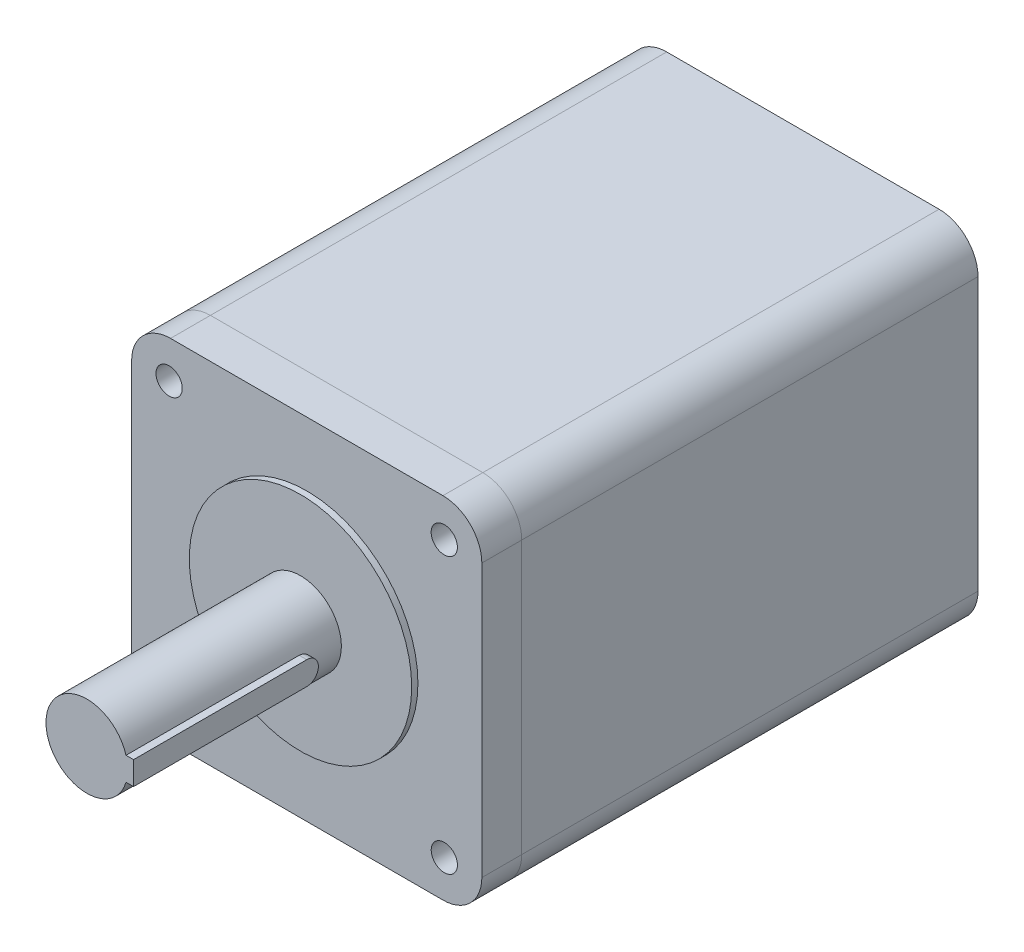
ISO-10303-21;
HEADER;
FILE_DESCRIPTION(('STEP AP214'),'2;1');
FILE_NAME('part.step','',(''),(''),'','','');
FILE_SCHEMA(('AUTOMOTIVE_DESIGN { 1 0 10303 214 1 1 1 1 }'));
ENDSEC;
DATA;
#1=APPLICATION_CONTEXT('core data for automotive mechanical design processes');
#2=APPLICATION_PROTOCOL_DEFINITION('international standard','automotive_design',2000,#1);
#3=PRODUCT_CONTEXT('',#1,'mechanical');
#4=PRODUCT('Part','Part','',(#3));
#5=PRODUCT_RELATED_PRODUCT_CATEGORY('part','',(#4));
#6=PRODUCT_DEFINITION_FORMATION('','',#4);
#7=PRODUCT_DEFINITION_CONTEXT('part definition',#1,'design');
#8=PRODUCT_DEFINITION('design','',#6,#7);
#9=PRODUCT_DEFINITION_SHAPE('','',#8);
#10=(LENGTH_UNIT() NAMED_UNIT(*) SI_UNIT(.MILLI.,.METRE.));
#11=(NAMED_UNIT(*) PLANE_ANGLE_UNIT() SI_UNIT($,.RADIAN.));
#12=(NAMED_UNIT(*) SI_UNIT($,.STERADIAN.) SOLID_ANGLE_UNIT());
#13=UNCERTAINTY_MEASURE_WITH_UNIT(LENGTH_MEASURE(1.E-05),#10,'distance_accuracy_value','');
#14=(GEOMETRIC_REPRESENTATION_CONTEXT(3) GLOBAL_UNCERTAINTY_ASSIGNED_CONTEXT((#13)) GLOBAL_UNIT_ASSIGNED_CONTEXT((#10,
#11,#12)) REPRESENTATION_CONTEXT('',''));
#15=CARTESIAN_POINT('',(0.,0.,0.));
#16=DIRECTION('',(0.,0.,1.));
#17=DIRECTION('',(1.,0.,0.));
#18=AXIS2_PLACEMENT_3D('',#15,#16,#17);
#19=CARTESIAN_POINT('',(-69.9999999999999,-70.,-234.5));
#20=DIRECTION('',(0.,0.,1.));
#21=DIRECTION('',(1.,0.,0.));
#22=AXIS2_PLACEMENT_3D('',#19,#20,#21);
#23=CYLINDRICAL_SURFACE('',#22,20.);
#24=CARTESIAN_POINT('',(-69.9999999999999,-70.,0.));
#25=DIRECTION('',(0.,0.,-1.));
#26=DIRECTION('',(1.,0.,0.));
#27=AXIS2_PLACEMENT_3D('',#24,#25,#26);
#28=CIRCLE('',#27,20.);
#29=CARTESIAN_POINT('',(-69.9999999999998,-90.,0.));
#30=VERTEX_POINT('',#29);
#31=CARTESIAN_POINT('',(-89.9999999999999,-69.9999999999999,0.));
#32=VERTEX_POINT('',#31);
#33=EDGE_CURVE('E144',#30,#32,#28,.T.);
#34=ORIENTED_EDGE('',*,*,#33,.T.);
#35=DIRECTION('',(0.,0.,1.));
#36=VECTOR('',#35,1.);
#37=CARTESIAN_POINT('',(-89.9999999999999,-69.9999999999999,-234.5));
#38=LINE('',#37,#36);
#39=CARTESIAN_POINT('',(-89.9999999999999,-69.9999999999999,-234.5));
#40=VERTEX_POINT('',#39);
#41=EDGE_CURVE('E12',#40,#32,#38,.T.);
#42=ORIENTED_EDGE('',*,*,#41,.F.);
#43=CARTESIAN_POINT('',(-69.9999999999999,-70.,-234.5));
#44=DIRECTION('',(0.,0.,-1.));
#45=DIRECTION('',(1.,0.,0.));
#46=AXIS2_PLACEMENT_3D('',#43,#44,#45);
#47=CIRCLE('',#46,20.);
#48=CARTESIAN_POINT('',(-69.9999999999998,-90.,-234.5));
#49=VERTEX_POINT('',#48);
#50=EDGE_CURVE('E158',#49,#40,#47,.T.);
#51=ORIENTED_EDGE('',*,*,#50,.F.);
#52=DIRECTION('',(0.,0.,1.));
#53=VECTOR('',#52,1.);
#54=CARTESIAN_POINT('',(-69.9999999999998,-90.,-234.5));
#55=LINE('',#54,#53);
#56=EDGE_CURVE('E140',#49,#30,#55,.T.);
#57=ORIENTED_EDGE('',*,*,#56,.T.);
#58=EDGE_LOOP('',(#34,#42,#51,#57));
#59=FACE_BOUND('',#58,.T.);
#60=ADVANCED_FACE('F48',(#59),#23,.T.);
#61=CARTESIAN_POINT('',(-89.9999999999999,-69.9999999999999,-234.5));
#62=DIRECTION('',(1.,0.,0.));
#63=DIRECTION('',(0.,0.,-1.));
#64=AXIS2_PLACEMENT_3D('',#61,#62,#63);
#65=PLANE('',#64);
#66=DIRECTION('',(0.,1.,0.));
#67=VECTOR('',#66,1.);
#68=CARTESIAN_POINT('',(-89.9999999999999,-69.9999999999999,0.));
#69=LINE('',#68,#67);
#70=CARTESIAN_POINT('',(-89.9999999999999,69.9999999999999,0.));
#71=VERTEX_POINT('',#70);
#72=EDGE_CURVE('E147',#32,#71,#69,.T.);
#73=ORIENTED_EDGE('',*,*,#72,.T.);
#74=DIRECTION('',(0.,0.,1.));
#75=VECTOR('',#74,1.);
#76=CARTESIAN_POINT('',(-89.9999999999999,69.9999999999999,-234.5));
#77=LINE('',#76,#75);
#78=CARTESIAN_POINT('',(-89.9999999999999,69.9999999999999,-234.5));
#79=VERTEX_POINT('',#78);
#80=EDGE_CURVE('E56',#79,#71,#77,.T.);
#81=ORIENTED_EDGE('',*,*,#80,.F.);
#82=DIRECTION('',(0.,1.,0.));
#83=VECTOR('',#82,1.);
#84=CARTESIAN_POINT('',(-89.9999999999999,-69.9999999999999,-234.5));
#85=LINE('',#84,#83);
#86=EDGE_CURVE('E107',#40,#79,#85,.T.);
#87=ORIENTED_EDGE('',*,*,#86,.F.);
#88=ORIENTED_EDGE('',*,*,#41,.T.);
#89=EDGE_LOOP('',(#73,#81,#87,#88));
#90=FACE_BOUND('',#89,.T.);
#91=ADVANCED_FACE('F193',(#90),#65,.F.);
#92=CARTESIAN_POINT('',(-69.9999999999999,70.,-234.5));
#93=DIRECTION('',(0.,0.,1.));
#94=DIRECTION('',(1.,0.,0.));
#95=AXIS2_PLACEMENT_3D('',#92,#93,#94);
#96=CYLINDRICAL_SURFACE('',#95,20.);
#97=CARTESIAN_POINT('',(-69.9999999999999,70.,0.));
#98=DIRECTION('',(0.,0.,-1.));
#99=DIRECTION('',(-1.,0.,0.));
#100=AXIS2_PLACEMENT_3D('',#97,#98,#99);
#101=CIRCLE('',#100,20.);
#102=CARTESIAN_POINT('',(-69.9999999999998,90.,0.));
#103=VERTEX_POINT('',#102);
#104=EDGE_CURVE('E149',#71,#103,#101,.T.);
#105=ORIENTED_EDGE('',*,*,#104,.T.);
#106=DIRECTION('',(0.,0.,1.));
#107=VECTOR('',#106,1.);
#108=CARTESIAN_POINT('',(-69.9999999999998,90.,-234.5));
#109=LINE('',#108,#107);
#110=CARTESIAN_POINT('',(-69.9999999999998,90.,-234.5));
#111=VERTEX_POINT('',#110);
#112=EDGE_CURVE('E165',#111,#103,#109,.T.);
#113=ORIENTED_EDGE('',*,*,#112,.F.);
#114=CARTESIAN_POINT('',(-69.9999999999999,70.,-234.5));
#115=DIRECTION('',(0.,0.,-1.));
#116=DIRECTION('',(-1.,0.,0.));
#117=AXIS2_PLACEMENT_3D('',#114,#115,#116);
#118=CIRCLE('',#117,20.);
#119=EDGE_CURVE('E173',#79,#111,#118,.T.);
#120=ORIENTED_EDGE('',*,*,#119,.F.);
#121=ORIENTED_EDGE('',*,*,#80,.T.);
#122=EDGE_LOOP('',(#105,#113,#120,#121));
#123=FACE_BOUND('',#122,.T.);
#124=ADVANCED_FACE('F171',(#123),#96,.T.);
#125=CARTESIAN_POINT('',(69.9999999999998,90.,-234.5));
#126=DIRECTION('',(0.,-1.,0.));
#127=DIRECTION('',(0.,0.,-1.));
#128=AXIS2_PLACEMENT_3D('',#125,#126,#127);
#129=PLANE('',#128);
#130=DIRECTION('',(1.,0.,0.));
#131=VECTOR('',#130,1.);
#132=CARTESIAN_POINT('',(69.9999999999998,90.,0.));
#133=LINE('',#132,#131);
#134=CARTESIAN_POINT('',(69.9999999999998,90.,0.));
#135=VERTEX_POINT('',#134);
#136=EDGE_CURVE('E151',#103,#135,#133,.T.);
#137=ORIENTED_EDGE('',*,*,#136,.T.);
#138=DIRECTION('',(0.,0.,1.));
#139=VECTOR('',#138,1.);
#140=CARTESIAN_POINT('',(69.9999999999998,90.,-234.5));
#141=LINE('',#140,#139);
#142=CARTESIAN_POINT('',(69.9999999999998,90.,-234.5));
#143=VERTEX_POINT('',#142);
#144=EDGE_CURVE('E162',#143,#135,#141,.T.);
#145=ORIENTED_EDGE('',*,*,#144,.F.);
#146=DIRECTION('',(1.,0.,0.));
#147=VECTOR('',#146,1.);
#148=CARTESIAN_POINT('',(69.9999999999998,90.,-234.5));
#149=LINE('',#148,#147);
#150=EDGE_CURVE('E185',#111,#143,#149,.T.);
#151=ORIENTED_EDGE('',*,*,#150,.F.);
#152=ORIENTED_EDGE('',*,*,#112,.T.);
#153=EDGE_LOOP('',(#137,#145,#151,#152));
#154=FACE_BOUND('',#153,.T.);
#155=ADVANCED_FACE('F181',(#154),#129,.F.);
#156=CARTESIAN_POINT('',(69.9999999999999,70.,-234.5));
#157=DIRECTION('',(0.,0.,1.));
#158=DIRECTION('',(1.,0.,0.));
#159=AXIS2_PLACEMENT_3D('',#156,#157,#158);
#160=CYLINDRICAL_SURFACE('',#159,20.);
#161=CARTESIAN_POINT('',(69.9999999999999,70.,0.));
#162=DIRECTION('',(0.,0.,-1.));
#163=DIRECTION('',(-1.,0.,0.));
#164=AXIS2_PLACEMENT_3D('',#161,#162,#163);
#165=CIRCLE('',#164,20.);
#166=CARTESIAN_POINT('',(89.9999999999999,69.9999999999999,0.));
#167=VERTEX_POINT('',#166);
#168=EDGE_CURVE('E153',#135,#167,#165,.T.);
#169=ORIENTED_EDGE('',*,*,#168,.T.);
#170=DIRECTION('',(0.,0.,1.));
#171=VECTOR('',#170,1.);
#172=CARTESIAN_POINT('',(89.9999999999999,69.9999999999999,-234.5));
#173=LINE('',#172,#171);
#174=CARTESIAN_POINT('',(89.9999999999999,69.9999999999999,-234.5));
#175=VERTEX_POINT('',#174);
#176=EDGE_CURVE('E135',#175,#167,#173,.T.);
#177=ORIENTED_EDGE('',*,*,#176,.F.);
#178=CARTESIAN_POINT('',(69.9999999999999,70.,-234.5));
#179=DIRECTION('',(0.,0.,-1.));
#180=DIRECTION('',(-1.,0.,0.));
#181=AXIS2_PLACEMENT_3D('',#178,#179,#180);
#182=CIRCLE('',#181,20.);
#183=EDGE_CURVE('E126',#143,#175,#182,.T.);
#184=ORIENTED_EDGE('',*,*,#183,.F.);
#185=ORIENTED_EDGE('',*,*,#144,.T.);
#186=EDGE_LOOP('',(#169,#177,#184,#185));
#187=FACE_BOUND('',#186,.T.);
#188=ADVANCED_FACE('F184',(#187),#160,.T.);
#189=CARTESIAN_POINT('',(89.9999999999999,-69.9999999999999,-234.5));
#190=DIRECTION('',(-1.,0.,0.));
#191=DIRECTION('',(0.,0.,1.));
#192=AXIS2_PLACEMENT_3D('',#189,#190,#191);
#193=PLANE('',#192);
#194=DIRECTION('',(0.,-1.,0.));
#195=VECTOR('',#194,1.);
#196=CARTESIAN_POINT('',(89.9999999999999,-69.9999999999999,0.));
#197=LINE('',#196,#195);
#198=CARTESIAN_POINT('',(89.9999999999999,-69.9999999999999,0.));
#199=VERTEX_POINT('',#198);
#200=EDGE_CURVE('E134',#167,#199,#197,.T.);
#201=ORIENTED_EDGE('',*,*,#200,.T.);
#202=DIRECTION('',(0.,0.,1.));
#203=VECTOR('',#202,1.);
#204=CARTESIAN_POINT('',(89.9999999999999,-69.9999999999999,-234.5));
#205=LINE('',#204,#203);
#206=CARTESIAN_POINT('',(89.9999999999999,-69.9999999999999,-234.5));
#207=VERTEX_POINT('',#206);
#208=EDGE_CURVE('E131',#207,#199,#205,.T.);
#209=ORIENTED_EDGE('',*,*,#208,.F.);
#210=DIRECTION('',(0.,-1.,0.));
#211=VECTOR('',#210,1.);
#212=CARTESIAN_POINT('',(89.9999999999999,-69.9999999999999,-234.5));
#213=LINE('',#212,#211);
#214=EDGE_CURVE('E120',#175,#207,#213,.T.);
#215=ORIENTED_EDGE('',*,*,#214,.F.);
#216=ORIENTED_EDGE('',*,*,#176,.T.);
#217=EDGE_LOOP('',(#201,#209,#215,#216));
#218=FACE_BOUND('',#217,.T.);
#219=ADVANCED_FACE('F132',(#218),#193,.F.);
#220=CARTESIAN_POINT('',(69.9999999999999,-70.,-234.5));
#221=DIRECTION('',(0.,0.,1.));
#222=DIRECTION('',(1.,0.,0.));
#223=AXIS2_PLACEMENT_3D('',#220,#221,#222);
#224=CYLINDRICAL_SURFACE('',#223,20.);
#225=CARTESIAN_POINT('',(69.9999999999999,-70.,0.));
#226=DIRECTION('',(0.,0.,-1.));
#227=DIRECTION('',(1.,0.,0.));
#228=AXIS2_PLACEMENT_3D('',#225,#226,#227);
#229=CIRCLE('',#228,20.);
#230=CARTESIAN_POINT('',(69.9999999999998,-90.,0.));
#231=VERTEX_POINT('',#230);
#232=EDGE_CURVE('E93',#199,#231,#229,.T.);
#233=ORIENTED_EDGE('',*,*,#232,.T.);
#234=DIRECTION('',(0.,0.,1.));
#235=VECTOR('',#234,1.);
#236=CARTESIAN_POINT('',(69.9999999999998,-90.,-234.5));
#237=LINE('',#236,#235);
#238=CARTESIAN_POINT('',(69.9999999999998,-90.,-234.5));
#239=VERTEX_POINT('',#238);
#240=EDGE_CURVE('E136',#239,#231,#237,.T.);
#241=ORIENTED_EDGE('',*,*,#240,.F.);
#242=CARTESIAN_POINT('',(69.9999999999999,-70.,-234.5));
#243=DIRECTION('',(0.,0.,-1.));
#244=DIRECTION('',(1.,0.,0.));
#245=AXIS2_PLACEMENT_3D('',#242,#243,#244);
#246=CIRCLE('',#245,20.);
#247=EDGE_CURVE('E124',#207,#239,#246,.T.);
#248=ORIENTED_EDGE('',*,*,#247,.F.);
#249=ORIENTED_EDGE('',*,*,#208,.T.);
#250=EDGE_LOOP('',(#233,#241,#248,#249));
#251=FACE_BOUND('',#250,.T.);
#252=ADVANCED_FACE('F138',(#251),#224,.T.);
#253=CARTESIAN_POINT('',(69.9999999999998,-90.,-234.5));
#254=DIRECTION('',(0.,1.,0.));
#255=DIRECTION('',(0.,0.,1.));
#256=AXIS2_PLACEMENT_3D('',#253,#254,#255);
#257=PLANE('',#256);
#258=DIRECTION('',(-1.,0.,0.));
#259=VECTOR('',#258,1.);
#260=CARTESIAN_POINT('',(69.9999999999998,-90.,0.));
#261=LINE('',#260,#259);
#262=EDGE_CURVE('E99',#231,#30,#261,.T.);
#263=ORIENTED_EDGE('',*,*,#262,.T.);
#264=ORIENTED_EDGE('',*,*,#56,.F.);
#265=DIRECTION('',(-1.,0.,0.));
#266=VECTOR('',#265,1.);
#267=CARTESIAN_POINT('',(69.9999999999998,-90.,-234.5));
#268=LINE('',#267,#266);
#269=EDGE_CURVE('E64',#239,#49,#268,.T.);
#270=ORIENTED_EDGE('',*,*,#269,.F.);
#271=ORIENTED_EDGE('',*,*,#240,.T.);
#272=EDGE_LOOP('',(#263,#264,#270,#271));
#273=FACE_BOUND('',#272,.T.);
#274=ADVANCED_FACE('F209',(#273),#257,.F.);
#275=CARTESIAN_POINT('',(-69.9999999999999,-70.,-234.5));
#276=DIRECTION('',(0.,0.,1.));
#277=DIRECTION('',(1.,0.,0.));
#278=AXIS2_PLACEMENT_3D('',#275,#276,#277);
#279=PLANE('',#278);
#280=ORIENTED_EDGE('',*,*,#50,.T.);
#281=ORIENTED_EDGE('',*,*,#86,.T.);
#282=ORIENTED_EDGE('',*,*,#119,.T.);
#283=ORIENTED_EDGE('',*,*,#150,.T.);
#284=ORIENTED_EDGE('',*,*,#183,.T.);
#285=ORIENTED_EDGE('',*,*,#214,.T.);
#286=ORIENTED_EDGE('',*,*,#247,.T.);
#287=ORIENTED_EDGE('',*,*,#269,.T.);
#288=EDGE_LOOP('',(#280,#281,#282,#283,#284,#285,#286,#287));
#289=FACE_BOUND('',#288,.T.);
#290=ADVANCED_FACE('F122',(#289),#279,.F.);
#291=CARTESIAN_POINT('',(-69.9999999999999,-70.,0.));
#292=DIRECTION('',(0.,0.,1.));
#293=DIRECTION('',(1.,0.,0.));
#294=AXIS2_PLACEMENT_3D('',#291,#292,#293);
#295=PLANE('',#294);
#296=ORIENTED_EDGE('',*,*,#33,.F.);
#297=ORIENTED_EDGE('',*,*,#262,.F.);
#298=ORIENTED_EDGE('',*,*,#232,.F.);
#299=ORIENTED_EDGE('',*,*,#200,.F.);
#300=ORIENTED_EDGE('',*,*,#168,.F.);
#301=ORIENTED_EDGE('',*,*,#136,.F.);
#302=ORIENTED_EDGE('',*,*,#104,.F.);
#303=ORIENTED_EDGE('',*,*,#72,.F.);
#304=EDGE_LOOP('',(#296,#297,#298,#299,#300,#301,#302,#303));
#305=FACE_BOUND('',#304,.T.);
#306=ADVANCED_FACE('F177',(#305),#295,.T.);
#307=CLOSED_SHELL('',(#60,#91,#124,#155,#188,#219,#252,#274,#290,#306));
#308=MANIFOLD_SOLID_BREP('B2',#307);
#309=CARTESIAN_POINT('',(70.0000000000001,-70.,20.5));
#310=DIRECTION('',(0.,0.,-1.));
#311=DIRECTION('',(-1.,0.,0.));
#312=AXIS2_PLACEMENT_3D('',#309,#310,#311);
#313=CYLINDRICAL_SURFACE('',#312,20.);
#314=CARTESIAN_POINT('',(70.0000000000001,-70.,0.));
#315=DIRECTION('',(0.,0.,1.));
#316=DIRECTION('',(1.,0.,0.));
#317=AXIS2_PLACEMENT_3D('',#314,#315,#316);
#318=CIRCLE('',#317,20.);
#319=CARTESIAN_POINT('',(69.9999999999999,-90.,0.));
#320=VERTEX_POINT('',#319);
#321=CARTESIAN_POINT('',(90.0000000000001,-69.9999999999998,0.));
#322=VERTEX_POINT('',#321);
#323=EDGE_CURVE('E404',#320,#322,#318,.T.);
#324=ORIENTED_EDGE('',*,*,#323,.T.);
#325=DIRECTION('',(0.,0.,-1.));
#326=VECTOR('',#325,1.);
#327=CARTESIAN_POINT('',(90.0000000000001,-69.9999999999998,20.5));
#328=LINE('',#327,#326);
#329=CARTESIAN_POINT('',(90.0000000000001,-69.9999999999998,20.5));
#330=VERTEX_POINT('',#329);
#331=EDGE_CURVE('E298',#330,#322,#328,.T.);
#332=ORIENTED_EDGE('',*,*,#331,.F.);
#333=CARTESIAN_POINT('',(70.0000000000001,-70.,20.5));
#334=DIRECTION('',(0.,0.,1.));
#335=DIRECTION('',(1.,0.,0.));
#336=AXIS2_PLACEMENT_3D('',#333,#334,#335);
#337=CIRCLE('',#336,20.);
#338=CARTESIAN_POINT('',(69.9999999999999,-90.,20.5));
#339=VERTEX_POINT('',#338);
#340=EDGE_CURVE('E420',#339,#330,#337,.T.);
#341=ORIENTED_EDGE('',*,*,#340,.F.);
#342=DIRECTION('',(0.,0.,-1.));
#343=VECTOR('',#342,1.);
#344=CARTESIAN_POINT('',(69.9999999999999,-90.,20.5));
#345=LINE('',#344,#343);
#346=EDGE_CURVE('E400',#339,#320,#345,.T.);
#347=ORIENTED_EDGE('',*,*,#346,.T.);
#348=EDGE_LOOP('',(#324,#332,#341,#347));
#349=FACE_BOUND('',#348,.T.);
#350=ADVANCED_FACE('F295',(#349),#313,.T.);
#351=CARTESIAN_POINT('',(90.0000000000001,-69.9999999999998,20.5));
#352=DIRECTION('',(-1.,0.,0.));
#353=DIRECTION('',(0.,0.,1.));
#354=AXIS2_PLACEMENT_3D('',#351,#352,#353);
#355=PLANE('',#354);
#356=DIRECTION('',(0.,1.,0.));
#357=VECTOR('',#356,1.);
#358=CARTESIAN_POINT('',(90.0000000000001,-69.9999999999998,0.));
#359=LINE('',#358,#357);
#360=CARTESIAN_POINT('',(90.0000000000001,69.9999999999999,0.));
#361=VERTEX_POINT('',#360);
#362=EDGE_CURVE('E407',#322,#361,#359,.T.);
#363=ORIENTED_EDGE('',*,*,#362,.T.);
#364=DIRECTION('',(0.,0.,-1.));
#365=VECTOR('',#364,1.);
#366=CARTESIAN_POINT('',(90.0000000000001,69.9999999999999,20.5));
#367=LINE('',#366,#365);
#368=CARTESIAN_POINT('',(90.0000000000001,69.9999999999999,20.5));
#369=VERTEX_POINT('',#368);
#370=EDGE_CURVE('E429',#369,#361,#367,.T.);
#371=ORIENTED_EDGE('',*,*,#370,.F.);
#372=DIRECTION('',(0.,1.,0.));
#373=VECTOR('',#372,1.);
#374=CARTESIAN_POINT('',(90.0000000000001,-69.9999999999998,20.5));
#375=LINE('',#374,#373);
#376=EDGE_CURVE('E361',#330,#369,#375,.T.);
#377=ORIENTED_EDGE('',*,*,#376,.F.);
#378=ORIENTED_EDGE('',*,*,#331,.T.);
#379=EDGE_LOOP('',(#363,#371,#377,#378));
#380=FACE_BOUND('',#379,.T.);
#381=ADVANCED_FACE('F435',(#380),#355,.F.);
#382=CARTESIAN_POINT('',(70.0000000000001,70.,20.5));
#383=DIRECTION('',(0.,0.,-1.));
#384=DIRECTION('',(-1.,0.,0.));
#385=AXIS2_PLACEMENT_3D('',#382,#383,#384);
#386=CYLINDRICAL_SURFACE('',#385,20.);
#387=CARTESIAN_POINT('',(70.0000000000001,70.,0.));
#388=DIRECTION('',(0.,0.,1.));
#389=DIRECTION('',(1.,0.,0.));
#390=AXIS2_PLACEMENT_3D('',#387,#388,#389);
#391=CIRCLE('',#390,20.);
#392=CARTESIAN_POINT('',(69.9999999999999,90.,0.));
#393=VERTEX_POINT('',#392);
#394=EDGE_CURVE('E410',#361,#393,#391,.T.);
#395=ORIENTED_EDGE('',*,*,#394,.T.);
#396=DIRECTION('',(0.,0.,-1.));
#397=VECTOR('',#396,1.);
#398=CARTESIAN_POINT('',(69.9999999999999,90.,20.5));
#399=LINE('',#398,#397);
#400=CARTESIAN_POINT('',(69.9999999999999,90.,20.5));
#401=VERTEX_POINT('',#400);
#402=EDGE_CURVE('E427',#401,#393,#399,.T.);
#403=ORIENTED_EDGE('',*,*,#402,.F.);
#404=CARTESIAN_POINT('',(70.0000000000001,70.,20.5));
#405=DIRECTION('',(0.,0.,1.));
#406=DIRECTION('',(1.,0.,0.));
#407=AXIS2_PLACEMENT_3D('',#404,#405,#406);
#408=CIRCLE('',#407,20.);
#409=EDGE_CURVE('E450',#369,#401,#408,.T.);
#410=ORIENTED_EDGE('',*,*,#409,.F.);
#411=ORIENTED_EDGE('',*,*,#370,.T.);
#412=EDGE_LOOP('',(#395,#403,#410,#411));
#413=FACE_BOUND('',#412,.T.);
#414=ADVANCED_FACE('F444',(#413),#386,.T.);
#415=CARTESIAN_POINT('',(-69.9999999999998,90.,20.5));
#416=DIRECTION('',(0.,-1.,0.));
#417=DIRECTION('',(0.,0.,-1.));
#418=AXIS2_PLACEMENT_3D('',#415,#416,#417);
#419=PLANE('',#418);
#420=DIRECTION('',(-1.,0.,0.));
#421=VECTOR('',#420,1.);
#422=CARTESIAN_POINT('',(-69.9999999999998,90.,0.));
#423=LINE('',#422,#421);
#424=CARTESIAN_POINT('',(-69.9999999999998,90.,0.));
#425=VERTEX_POINT('',#424);
#426=EDGE_CURVE('E412',#393,#425,#423,.T.);
#427=ORIENTED_EDGE('',*,*,#426,.T.);
#428=DIRECTION('',(0.,0.,-1.));
#429=VECTOR('',#428,1.);
#430=CARTESIAN_POINT('',(-69.9999999999998,90.,20.5));
#431=LINE('',#430,#429);
#432=CARTESIAN_POINT('',(-69.9999999999998,90.,20.5));
#433=VERTEX_POINT('',#432);
#434=EDGE_CURVE('E424',#433,#425,#431,.T.);
#435=ORIENTED_EDGE('',*,*,#434,.F.);
#436=DIRECTION('',(-1.,0.,0.));
#437=VECTOR('',#436,1.);
#438=CARTESIAN_POINT('',(-69.9999999999998,90.,20.5));
#439=LINE('',#438,#437);
#440=EDGE_CURVE('E449',#401,#433,#439,.T.);
#441=ORIENTED_EDGE('',*,*,#440,.F.);
#442=ORIENTED_EDGE('',*,*,#402,.T.);
#443=EDGE_LOOP('',(#427,#435,#441,#442));
#444=FACE_BOUND('',#443,.T.);
#445=ADVANCED_FACE('F447',(#444),#419,.F.);
#446=CARTESIAN_POINT('',(-69.9999999999999,70.,20.5));
#447=DIRECTION('',(0.,0.,-1.));
#448=DIRECTION('',(-1.,0.,0.));
#449=AXIS2_PLACEMENT_3D('',#446,#447,#448);
#450=CYLINDRICAL_SURFACE('',#449,20.);
#451=CARTESIAN_POINT('',(-69.9999999999999,70.,0.));
#452=DIRECTION('',(0.,0.,1.));
#453=DIRECTION('',(1.,0.,0.));
#454=AXIS2_PLACEMENT_3D('',#451,#452,#453);
#455=CIRCLE('',#454,20.);
#456=CARTESIAN_POINT('',(-89.9999999999999,69.9999999999999,0.));
#457=VERTEX_POINT('',#456);
#458=EDGE_CURVE('E414',#425,#457,#455,.T.);
#459=ORIENTED_EDGE('',*,*,#458,.T.);
#460=DIRECTION('',(0.,0.,-1.));
#461=VECTOR('',#460,1.);
#462=CARTESIAN_POINT('',(-89.9999999999999,69.9999999999999,20.5));
#463=LINE('',#462,#461);
#464=CARTESIAN_POINT('',(-89.9999999999999,69.9999999999999,20.5));
#465=VERTEX_POINT('',#464);
#466=EDGE_CURVE('E395',#465,#457,#463,.T.);
#467=ORIENTED_EDGE('',*,*,#466,.F.);
#468=CARTESIAN_POINT('',(-69.9999999999999,70.,20.5));
#469=DIRECTION('',(0.,0.,1.));
#470=DIRECTION('',(1.,0.,0.));
#471=AXIS2_PLACEMENT_3D('',#468,#469,#470);
#472=CIRCLE('',#471,20.);
#473=EDGE_CURVE('E383',#433,#465,#472,.T.);
#474=ORIENTED_EDGE('',*,*,#473,.F.);
#475=ORIENTED_EDGE('',*,*,#434,.T.);
#476=EDGE_LOOP('',(#459,#467,#474,#475));
#477=FACE_BOUND('',#476,.T.);
#478=ADVANCED_FACE('F581',(#477),#450,.T.);
#479=CARTESIAN_POINT('',(-89.9999999999999,-69.9999999999998,20.5));
#480=DIRECTION('',(1.,0.,0.));
#481=DIRECTION('',(0.,0.,-1.));
#482=AXIS2_PLACEMENT_3D('',#479,#480,#481);
#483=PLANE('',#482);
#484=DIRECTION('',(0.,-1.,0.));
#485=VECTOR('',#484,1.);
#486=CARTESIAN_POINT('',(-89.9999999999999,-69.9999999999998,0.));
#487=LINE('',#486,#485);
#488=CARTESIAN_POINT('',(-89.9999999999999,-70.,0.));
#489=VERTEX_POINT('',#488);
#490=EDGE_CURVE('E392',#457,#489,#487,.T.);
#491=ORIENTED_EDGE('',*,*,#490,.T.);
#492=DIRECTION('',(0.,0.,-1.));
#493=VECTOR('',#492,1.);
#494=CARTESIAN_POINT('',(-89.9999999999999,-70.,20.5));
#495=LINE('',#494,#493);
#496=CARTESIAN_POINT('',(-89.9999999999999,-70.,20.5));
#497=VERTEX_POINT('',#496);
#498=EDGE_CURVE('E389',#497,#489,#495,.T.);
#499=ORIENTED_EDGE('',*,*,#498,.F.);
#500=DIRECTION('',(0.,-1.,0.));
#501=VECTOR('',#500,1.);
#502=CARTESIAN_POINT('',(-89.9999999999999,-69.9999999999998,20.5));
#503=LINE('',#502,#501);
#504=EDGE_CURVE('E376',#465,#497,#503,.T.);
#505=ORIENTED_EDGE('',*,*,#504,.F.);
#506=ORIENTED_EDGE('',*,*,#466,.T.);
#507=EDGE_LOOP('',(#491,#499,#505,#506));
#508=FACE_BOUND('',#507,.T.);
#509=ADVANCED_FACE('F390',(#508),#483,.F.);
#510=CARTESIAN_POINT('',(-69.9999999999999,-70.,20.5));
#511=DIRECTION('',(0.,0.,-1.));
#512=DIRECTION('',(-1.,0.,0.));
#513=AXIS2_PLACEMENT_3D('',#510,#511,#512);
#514=CYLINDRICAL_SURFACE('',#513,20.);
#515=CARTESIAN_POINT('',(-69.9999999999999,-70.,0.));
#516=DIRECTION('',(0.,0.,1.));
#517=DIRECTION('',(-1.,0.,0.));
#518=AXIS2_PLACEMENT_3D('',#515,#516,#517);
#519=CIRCLE('',#518,20.);
#520=CARTESIAN_POINT('',(-69.9999999999998,-90.,0.));
#521=VERTEX_POINT('',#520);
#522=EDGE_CURVE('E417',#489,#521,#519,.T.);
#523=ORIENTED_EDGE('',*,*,#522,.T.);
#524=DIRECTION('',(0.,0.,-1.));
#525=VECTOR('',#524,1.);
#526=CARTESIAN_POINT('',(-69.9999999999998,-90.,20.5));
#527=LINE('',#526,#525);
#528=CARTESIAN_POINT('',(-69.9999999999998,-90.,20.5));
#529=VERTEX_POINT('',#528);
#530=EDGE_CURVE('E396',#529,#521,#527,.T.);
#531=ORIENTED_EDGE('',*,*,#530,.F.);
#532=CARTESIAN_POINT('',(-69.9999999999999,-70.,20.5));
#533=DIRECTION('',(0.,0.,1.));
#534=DIRECTION('',(-1.,0.,0.));
#535=AXIS2_PLACEMENT_3D('',#532,#533,#534);
#536=CIRCLE('',#535,20.);
#537=EDGE_CURVE('E380',#497,#529,#536,.T.);
#538=ORIENTED_EDGE('',*,*,#537,.F.);
#539=ORIENTED_EDGE('',*,*,#498,.T.);
#540=EDGE_LOOP('',(#523,#531,#538,#539));
#541=FACE_BOUND('',#540,.T.);
#542=ADVANCED_FACE('F398',(#541),#514,.T.);
#543=CARTESIAN_POINT('',(-69.9999999999998,-90.,20.5));
#544=DIRECTION('',(0.,1.,0.));
#545=DIRECTION('',(0.,0.,1.));
#546=AXIS2_PLACEMENT_3D('',#543,#544,#545);
#547=PLANE('',#546);
#548=DIRECTION('',(1.,0.,0.));
#549=VECTOR('',#548,1.);
#550=CARTESIAN_POINT('',(-69.9999999999998,-90.,0.));
#551=LINE('',#550,#549);
#552=EDGE_CURVE('E352',#521,#320,#551,.T.);
#553=ORIENTED_EDGE('',*,*,#552,.T.);
#554=ORIENTED_EDGE('',*,*,#346,.F.);
#555=DIRECTION('',(1.,0.,0.));
#556=VECTOR('',#555,1.);
#557=CARTESIAN_POINT('',(-69.9999999999998,-90.,20.5));
#558=LINE('',#557,#556);
#559=EDGE_CURVE('E319',#529,#339,#558,.T.);
#560=ORIENTED_EDGE('',*,*,#559,.F.);
#561=ORIENTED_EDGE('',*,*,#530,.T.);
#562=EDGE_LOOP('',(#553,#554,#560,#561));
#563=FACE_BOUND('',#562,.T.);
#564=ADVANCED_FACE('F570',(#563),#547,.F.);
#565=CARTESIAN_POINT('',(70.0000000000001,-70.,20.5));
#566=DIRECTION('',(0.,0.,1.));
#567=DIRECTION('',(1.,0.,0.));
#568=AXIS2_PLACEMENT_3D('',#565,#566,#567);
#569=PLANE('',#568);
#570=CARTESIAN_POINT('',(0.,0.,20.5));
#571=DIRECTION('',(0.,0.,1.));
#572=DIRECTION('',(1.,0.,0.));
#573=AXIS2_PLACEMENT_3D('',#570,#571,#572);
#574=CIRCLE('',#573,57.15);
#575=CARTESIAN_POINT('',(57.15,0.,20.5));
#576=VERTEX_POINT('',#575);
#577=EDGE_CURVE('E480',#576,#576,#574,.T.);
#578=ORIENTED_EDGE('',*,*,#577,.F.);
#579=EDGE_LOOP('',(#578));
#580=FACE_BOUND('',#579,.T.);
#581=CARTESIAN_POINT('',(-70.6938670916898,-70.7274851498518,20.5));
#582=DIRECTION('',(0.,0.,1.));
#583=DIRECTION('',(1.,0.,0.));
#584=AXIS2_PLACEMENT_3D('',#581,#582,#583);
#585=CIRCLE('',#584,6.75000000000001);
#586=CARTESIAN_POINT('',(-63.9438670916898,-70.7274851498518,20.5));
#587=VERTEX_POINT('',#586);
#588=EDGE_CURVE('E462',#587,#587,#585,.T.);
#589=ORIENTED_EDGE('',*,*,#588,.F.);
#590=EDGE_LOOP('',(#589));
#591=FACE_BOUND('',#590,.T.);
#592=CARTESIAN_POINT('',(70.727485149852,-70.6938670916896,20.5));
#593=DIRECTION('',(0.,0.,1.));
#594=DIRECTION('',(1.,0.,0.));
#595=AXIS2_PLACEMENT_3D('',#592,#593,#594);
#596=CIRCLE('',#595,6.75);
#597=CARTESIAN_POINT('',(77.477485149852,-70.6938670916896,20.5));
#598=VERTEX_POINT('',#597);
#599=EDGE_CURVE('E470',#598,#598,#596,.T.);
#600=ORIENTED_EDGE('',*,*,#599,.F.);
#601=EDGE_LOOP('',(#600));
#602=FACE_BOUND('',#601,.T.);
#603=CARTESIAN_POINT('',(70.6938670916893,70.7274851498522,20.5));
#604=DIRECTION('',(0.,0.,1.));
#605=DIRECTION('',(1.,0.,0.));
#606=AXIS2_PLACEMENT_3D('',#603,#604,#605);
#607=CIRCLE('',#606,6.74999999999999);
#608=CARTESIAN_POINT('',(77.4438670916893,70.7274851498522,20.5));
#609=VERTEX_POINT('',#608);
#610=EDGE_CURVE('E461',#609,#609,#607,.T.);
#611=ORIENTED_EDGE('',*,*,#610,.F.);
#612=EDGE_LOOP('',(#611));
#613=FACE_BOUND('',#612,.T.);
#614=CARTESIAN_POINT('',(-70.7274851498525,70.6938670916891,20.5));
#615=DIRECTION('',(0.,0.,1.));
#616=DIRECTION('',(1.,0.,0.));
#617=AXIS2_PLACEMENT_3D('',#614,#615,#616);
#618=CIRCLE('',#617,6.75);
#619=CARTESIAN_POINT('',(-63.9774851498525,70.6938670916891,20.5));
#620=VERTEX_POINT('',#619);
#621=EDGE_CURVE('E458',#620,#620,#618,.T.);
#622=ORIENTED_EDGE('',*,*,#621,.F.);
#623=EDGE_LOOP('',(#622));
#624=FACE_BOUND('',#623,.T.);
#625=ORIENTED_EDGE('',*,*,#340,.T.);
#626=ORIENTED_EDGE('',*,*,#376,.T.);
#627=ORIENTED_EDGE('',*,*,#409,.T.);
#628=ORIENTED_EDGE('',*,*,#440,.T.);
#629=ORIENTED_EDGE('',*,*,#473,.T.);
#630=ORIENTED_EDGE('',*,*,#504,.T.);
#631=ORIENTED_EDGE('',*,*,#537,.T.);
#632=ORIENTED_EDGE('',*,*,#559,.T.);
#633=EDGE_LOOP('',(#625,#626,#627,#628,#629,#630,#631,#632));
#634=FACE_BOUND('',#633,.T.);
#635=ADVANCED_FACE('F378',(#580,#591,#602,#613,#624,#634),#569,.T.);
#636=CARTESIAN_POINT('',(70.0000000000001,-70.,0.));
#637=DIRECTION('',(0.,0.,1.));
#638=DIRECTION('',(1.,0.,0.));
#639=AXIS2_PLACEMENT_3D('',#636,#637,#638);
#640=PLANE('',#639);
#641=CARTESIAN_POINT('',(-70.6938670916898,-70.7274851498518,0.));
#642=DIRECTION('',(0.,0.,1.));
#643=DIRECTION('',(1.,0.,0.));
#644=AXIS2_PLACEMENT_3D('',#641,#642,#643);
#645=CIRCLE('',#644,6.75000000000001);
#646=CARTESIAN_POINT('',(-63.9438670916898,-70.7274851498518,0.));
#647=VERTEX_POINT('',#646);
#648=EDGE_CURVE('E466',#647,#647,#645,.F.);
#649=ORIENTED_EDGE('',*,*,#648,.F.);
#650=EDGE_LOOP('',(#649));
#651=FACE_BOUND('',#650,.T.);
#652=CARTESIAN_POINT('',(70.727485149852,-70.6938670916896,0.));
#653=DIRECTION('',(0.,0.,1.));
#654=DIRECTION('',(1.,0.,0.));
#655=AXIS2_PLACEMENT_3D('',#652,#653,#654);
#656=CIRCLE('',#655,6.75);
#657=CARTESIAN_POINT('',(77.477485149852,-70.6938670916896,0.));
#658=VERTEX_POINT('',#657);
#659=EDGE_CURVE('E465',#658,#658,#656,.F.);
#660=ORIENTED_EDGE('',*,*,#659,.F.);
#661=EDGE_LOOP('',(#660));
#662=FACE_BOUND('',#661,.T.);
#663=CARTESIAN_POINT('',(70.6938670916893,70.7274851498522,0.));
#664=DIRECTION('',(0.,0.,1.));
#665=DIRECTION('',(1.,0.,0.));
#666=AXIS2_PLACEMENT_3D('',#663,#664,#665);
#667=CIRCLE('',#666,6.74999999999999);
#668=CARTESIAN_POINT('',(77.4438670916893,70.7274851498522,0.));
#669=VERTEX_POINT('',#668);
#670=EDGE_CURVE('E473',#669,#669,#667,.F.);
#671=ORIENTED_EDGE('',*,*,#670,.F.);
#672=EDGE_LOOP('',(#671));
#673=FACE_BOUND('',#672,.T.);
#674=CARTESIAN_POINT('',(-70.7274851498525,70.6938670916891,0.));
#675=DIRECTION('',(0.,0.,1.));
#676=DIRECTION('',(1.,0.,0.));
#677=AXIS2_PLACEMENT_3D('',#674,#675,#676);
#678=CIRCLE('',#677,6.75);
#679=CARTESIAN_POINT('',(-63.9774851498525,70.6938670916891,0.));
#680=VERTEX_POINT('',#679);
#681=EDGE_CURVE('E408',#680,#680,#678,.F.);
#682=ORIENTED_EDGE('',*,*,#681,.F.);
#683=EDGE_LOOP('',(#682));
#684=FACE_BOUND('',#683,.T.);
#685=ORIENTED_EDGE('',*,*,#323,.F.);
#686=ORIENTED_EDGE('',*,*,#552,.F.);
#687=ORIENTED_EDGE('',*,*,#522,.F.);
#688=ORIENTED_EDGE('',*,*,#490,.F.);
#689=ORIENTED_EDGE('',*,*,#458,.F.);
#690=ORIENTED_EDGE('',*,*,#426,.F.);
#691=ORIENTED_EDGE('',*,*,#394,.F.);
#692=ORIENTED_EDGE('',*,*,#362,.F.);
#693=EDGE_LOOP('',(#685,#686,#687,#688,#689,#690,#691,#692));
#694=FACE_BOUND('',#693,.T.);
#695=ADVANCED_FACE('F440',(#651,#662,#673,#684,#694),#640,.F.);
#696=CARTESIAN_POINT('',(-70.7274851498525,70.6938670916891,-0.001000000000001));
#697=DIRECTION('',(0.,0.,1.));
#698=DIRECTION('',(1.,0.,0.));
#699=AXIS2_PLACEMENT_3D('',#696,#697,#698);
#700=CYLINDRICAL_SURFACE('',#699,6.75);
#701=ORIENTED_EDGE('',*,*,#621,.T.);
#702=EDGE_LOOP('',(#701));
#703=FACE_BOUND('',#702,.T.);
#704=ORIENTED_EDGE('',*,*,#681,.T.);
#705=EDGE_LOOP('',(#704));
#706=FACE_BOUND('',#705,.T.);
#707=ADVANCED_FACE('F557',(#703,#706),#700,.F.);
#708=CARTESIAN_POINT('',(70.6938670916893,70.7274851498522,-0.001000000000001));
#709=DIRECTION('',(0.,0.,1.));
#710=DIRECTION('',(1.,0.,0.));
#711=AXIS2_PLACEMENT_3D('',#708,#709,#710);
#712=CYLINDRICAL_SURFACE('',#711,6.74999999999999);
#713=ORIENTED_EDGE('',*,*,#610,.T.);
#714=EDGE_LOOP('',(#713));
#715=FACE_BOUND('',#714,.T.);
#716=ORIENTED_EDGE('',*,*,#670,.T.);
#717=EDGE_LOOP('',(#716));
#718=FACE_BOUND('',#717,.T.);
#719=ADVANCED_FACE('F553',(#715,#718),#712,.F.);
#720=CARTESIAN_POINT('',(70.727485149852,-70.6938670916896,-0.001000000000001));
#721=DIRECTION('',(0.,0.,1.));
#722=DIRECTION('',(1.,0.,0.));
#723=AXIS2_PLACEMENT_3D('',#720,#721,#722);
#724=CYLINDRICAL_SURFACE('',#723,6.75);
#725=ORIENTED_EDGE('',*,*,#599,.T.);
#726=EDGE_LOOP('',(#725));
#727=FACE_BOUND('',#726,.T.);
#728=ORIENTED_EDGE('',*,*,#659,.T.);
#729=EDGE_LOOP('',(#728));
#730=FACE_BOUND('',#729,.T.);
#731=ADVANCED_FACE('F556',(#727,#730),#724,.F.);
#732=CARTESIAN_POINT('',(-70.6938670916898,-70.7274851498518,-0.001000000000001));
#733=DIRECTION('',(0.,0.,1.));
#734=DIRECTION('',(1.,0.,0.));
#735=AXIS2_PLACEMENT_3D('',#732,#733,#734);
#736=CYLINDRICAL_SURFACE('',#735,6.75000000000001);
#737=ORIENTED_EDGE('',*,*,#588,.T.);
#738=EDGE_LOOP('',(#737));
#739=FACE_BOUND('',#738,.T.);
#740=ORIENTED_EDGE('',*,*,#648,.T.);
#741=EDGE_LOOP('',(#740));
#742=FACE_BOUND('',#741,.T.);
#743=ADVANCED_FACE('F551',(#739,#742),#736,.F.);
#744=CARTESIAN_POINT('',(0.,0.,23.7));
#745=DIRECTION('',(0.,0.,-1.));
#746=DIRECTION('',(-1.,0.,0.));
#747=AXIS2_PLACEMENT_3D('',#744,#745,#746);
#748=CYLINDRICAL_SURFACE('',#747,57.15);
#749=CARTESIAN_POINT('',(0.,0.,23.7));
#750=DIRECTION('',(0.,0.,1.));
#751=DIRECTION('',(1.,0.,0.));
#752=AXIS2_PLACEMENT_3D('',#749,#750,#751);
#753=CIRCLE('',#752,57.15);
#754=CARTESIAN_POINT('',(57.15,0.,23.7));
#755=VERTEX_POINT('',#754);
#756=EDGE_CURVE('E469',#755,#755,#753,.T.);
#757=ORIENTED_EDGE('',*,*,#756,.F.);
#758=EDGE_LOOP('',(#757));
#759=FACE_BOUND('',#758,.T.);
#760=ORIENTED_EDGE('',*,*,#577,.T.);
#761=EDGE_LOOP('',(#760));
#762=FACE_BOUND('',#761,.T.);
#763=ADVANCED_FACE('F547',(#759,#762),#748,.T.);
#764=CARTESIAN_POINT('',(0.,0.,23.7));
#765=DIRECTION('',(0.,0.,1.));
#766=DIRECTION('',(1.,0.,0.));
#767=AXIS2_PLACEMENT_3D('',#764,#765,#766);
#768=PLANE('',#767);
#769=CARTESIAN_POINT('',(0.,0.,23.7));
#770=DIRECTION('',(0.,0.,1.));
#771=DIRECTION('',(1.,0.,0.));
#772=AXIS2_PLACEMENT_3D('',#769,#770,#771);
#773=CIRCLE('',#772,21.);
#774=CARTESIAN_POINT('',(21.,0.,23.7));
#775=VERTEX_POINT('',#774);
#776=EDGE_CURVE('E46',#775,#775,#773,.T.);
#777=ORIENTED_EDGE('',*,*,#776,.F.);
#778=EDGE_LOOP('',(#777));
#779=FACE_BOUND('',#778,.T.);
#780=ORIENTED_EDGE('',*,*,#756,.T.);
#781=EDGE_LOOP('',(#780));
#782=FACE_BOUND('',#781,.T.);
#783=ADVANCED_FACE('F543',(#779,#782),#768,.T.);
#784=CARTESIAN_POINT('',(0.,0.,133.5));
#785=DIRECTION('',(0.,0.,-1.));
#786=DIRECTION('',(-1.,0.,0.));
#787=AXIS2_PLACEMENT_3D('',#784,#785,#786);
#788=CYLINDRICAL_SURFACE('',#787,21.);
#789=DIRECTION('',(0.,0.,-1.));
#790=VECTOR('',#789,1.);
#791=CARTESIAN_POINT('',(20.1246117974981,6.,133.5));
#792=LINE('',#791,#790);
#793=CARTESIAN_POINT('',(20.1246117974981,6.,133.5));
#794=VERTEX_POINT('',#793);
#795=CARTESIAN_POINT('',(20.1246117974981,6.,44.5));
#796=VERTEX_POINT('',#795);
#797=EDGE_CURVE('E490',#794,#796,#792,.T.);
#798=ORIENTED_EDGE('',*,*,#797,.T.);
#799=CARTESIAN_POINT('',(20.1246117974981,-6.,44.5));
#800=CARTESIAN_POINT('',(20.1245894844569,-6.00002192169975,44.3349476686878));
#801=CARTESIAN_POINT('',(20.1266415650335,-5.9931904240759,44.1699033480747));
#802=CARTESIAN_POINT('',(20.1347317436705,-5.96598259693693,43.8410664783761));
#803=CARTESIAN_POINT('',(20.1407690151806,-5.94560907610498,43.6772736768431));
#804=CARTESIAN_POINT('',(20.1566481622527,-5.89154299099,43.3524900436761));
#805=CARTESIAN_POINT('',(20.1664810208216,-5.85788198887895,43.1914935092707));
#806=CARTESIAN_POINT('',(20.1896457121068,-5.77753958210296,42.8730397705281));
#807=CARTESIAN_POINT('',(20.2029776228772,-5.73085788698048,42.7155826452304));
#808=CARTESIAN_POINT('',(20.2327374247249,-5.62488729317033,42.4053644538818));
#809=CARTESIAN_POINT('',(20.2491637507907,-5.56560476546174,42.2526010591883));
#810=CARTESIAN_POINT('',(20.2846467474582,-5.43485915630499,41.9526316357059));
#811=CARTESIAN_POINT('',(20.3037043952519,-5.36339154736578,41.8054276975132));
#812=CARTESIAN_POINT('',(20.3439081708857,-5.20881695763319,41.5175654038802));
#813=CARTESIAN_POINT('',(20.3650542979004,-5.12570998143986,41.3769070458528));
#814=CARTESIAN_POINT('',(20.4088630364894,-4.94839867436059,41.1029445819205));
#815=CARTESIAN_POINT('',(20.4315262203764,-4.85419014508329,40.9696432864777));
#816=CARTESIAN_POINT('',(20.4783436926205,-4.65278362553808,40.7079618252647));
#817=CARTESIAN_POINT('',(20.5025212494045,-4.54531610125278,40.57979320088));
#818=CARTESIAN_POINT('',(20.5511665277305,-4.32005021369055,40.3328537026922));
#819=CARTESIAN_POINT('',(20.5756343537369,-4.20224802715341,40.214086338014));
#820=CARTESIAN_POINT('',(20.6241797197623,-3.95712206741072,39.9867841787276));
#821=CARTESIAN_POINT('',(20.6482573358332,-3.82980017742368,39.8782473698315));
#822=CARTESIAN_POINT('',(20.6953839164428,-3.56636964243009,39.6720609950033));
#823=CARTESIAN_POINT('',(20.7184324987362,-3.43025777747808,39.5744154548953));
#824=CARTESIAN_POINT('',(20.7632735217347,-3.14758929991083,39.3890544105514));
#825=CARTESIAN_POINT('',(20.7850352899035,-3.00088721837234,39.3015531104186));
#826=CARTESIAN_POINT('',(20.826226420028,-2.7002441525681,39.1392281166546));
#827=CARTESIAN_POINT('',(20.8456549445903,-2.54630059678402,39.0644089706658));
#828=CARTESIAN_POINT('',(20.8816082415408,-2.23235057760216,38.928116616058));
#829=CARTESIAN_POINT('',(20.898134058101,-2.07234631966332,38.8666386064382));
#830=CARTESIAN_POINT('',(20.9278108104084,-1.74738349510969,38.7575245389665));
#831=CARTESIAN_POINT('',(20.9409618867737,-1.58242513524158,38.7098879043636));
#832=CARTESIAN_POINT('',(20.9632114411614,-1.25311298298006,38.6299344248789));
#833=CARTESIAN_POINT('',(20.9724060858907,-1.0888542499211,38.5972526523776));
#834=CARTESIAN_POINT('',(20.9869654862023,-0.758072191863186,38.5457299012455));
#835=CARTESIAN_POINT('',(20.9923316727767,-0.591549736734745,38.5268837510921));
#836=CARTESIAN_POINT('',(20.9990869856429,-0.257425560637048,38.5031855496665));
#837=CARTESIAN_POINT('',(21.0004759736798,-0.0898238023521062,38.4983339848731));
#838=CARTESIAN_POINT('',(20.999236691677,0.245181542828508,38.5026717250827));
#839=CARTESIAN_POINT('',(20.9966084880238,0.412585132953269,38.5118607980561));
#840=CARTESIAN_POINT('',(20.9875445764644,0.741067651658932,38.5437217228001));
#841=CARTESIAN_POINT('',(20.9812220240654,0.902188755140116,38.5659929787235));
#842=CARTESIAN_POINT('',(20.9650286514685,1.22197090652231,38.6235055190406));
#843=CARTESIAN_POINT('',(20.9551566896347,1.38063114576116,38.6587509765576));
#844=CARTESIAN_POINT('',(20.9321284663263,1.69432288207989,38.7419103471373));
#845=CARTESIAN_POINT('',(20.918972706835,1.84935492983109,38.7898223239775));
#846=CARTESIAN_POINT('',(20.8897205698511,2.15478873602949,38.8979350379226));
#847=CARTESIAN_POINT('',(20.8736241040379,2.30519035524903,38.9581361441223));
#848=CARTESIAN_POINT('',(20.8387145142278,2.60202980978099,39.0911016236427));
#849=CARTESIAN_POINT('',(20.8198732783987,2.74840530116377,39.1639977471682));
#850=CARTESIAN_POINT('',(20.7801082571492,3.0344604453685,39.3213237622946));
#851=CARTESIAN_POINT('',(20.7591851160121,3.17414215000025,39.4057500886597));
#852=CARTESIAN_POINT('',(20.7157807359019,3.44606990247428,39.5856140209091));
#853=CARTESIAN_POINT('',(20.6932987274225,3.57831221881556,39.6810570806759));
#854=CARTESIAN_POINT('',(20.6473712971919,3.83444718075925,39.8822592812033));
#855=CARTESIAN_POINT('',(20.6239261924859,3.95834253922789,39.9880150425891));
#856=CARTESIAN_POINT('',(20.5758300072593,4.20132091996746,40.2131256380301));
#857=CARTESIAN_POINT('',(20.551165615785,4.32007832115665,40.3328293520202));
#858=CARTESIAN_POINT('',(20.5021333353903,4.54708837545201,40.5817915735415));
#859=CARTESIAN_POINT('',(20.4777653468064,4.65534464996528,40.7110467598762));
#860=CARTESIAN_POINT('',(20.4299846752419,4.86074636422664,40.9784120958696));
#861=CARTESIAN_POINT('',(20.406572642352,4.95788432140759,41.1165281123953));
#862=CARTESIAN_POINT('',(20.3614014610979,5.14024855061122,41.4005934756881));
#863=CARTESIAN_POINT('',(20.3396416713267,5.22547945590107,41.5465397447818));
#864=CARTESIAN_POINT('',(20.2982196174412,5.38414968403492,41.8466989995398));
#865=CARTESIAN_POINT('',(20.2785778839985,5.45747656574094,42.0009743153052));
#866=CARTESIAN_POINT('',(20.242230137917,5.59078652189584,42.3154498336678));
#867=CARTESIAN_POINT('',(20.2255229337991,5.65077501464743,42.4756475994994));
#868=CARTESIAN_POINT('',(20.1955798271004,5.75687380467081,42.8007052034523));
#869=CARTESIAN_POINT('',(20.1823402998655,5.80299860073585,42.9655599723875));
#870=CARTESIAN_POINT('',(20.1597438752569,5.88101802101864,43.298794657505));
#871=CARTESIAN_POINT('',(20.1503851792111,5.91291923804017,43.4671729025434));
#872=CARTESIAN_POINT('',(20.136996182678,5.95834488604588,43.7795981364479));
#873=CARTESIAN_POINT('',(20.1323602730056,5.97396720737166,43.9233179553707));
#874=CARTESIAN_POINT('',(20.1261641867038,5.99479248698429,44.2113547540817));
#875=CARTESIAN_POINT('',(20.1245993190641,6.00001133674436,44.3556704851378));
#876=CARTESIAN_POINT('',(20.1246117974981,6.,44.5));
#877=B_SPLINE_CURVE_WITH_KNOTS('',3,(#799,#800,#801,#802,#803,#804,#805,#806,#807,#808,#809,
#810,#811,#812,#813,#814,#815,#816,#817,#818,#819,#820,#821,#822,#823,#824,#825,#826,#827,#828,
#829,#830,#831,#832,#833,#834,#835,#836,#837,#838,#839,#840,#841,#842,#843,#844,#845,#846,#847,
#848,#849,#850,#851,#852,#853,#854,#855,#856,#857,#858,#859,#860,#861,#862,#863,#864,#865,#866,
#867,#868,#869,#870,#871,#872,#873,#874,#875,#876),.UNSPECIFIED.,.F.,.F.,(4,2,2,2,2,2,2,2,2,2,2,
2,2,2,2,2,2,2,2,2,2,2,2,2,2,2,2,2,2,2,2,2,2,2,2,2,2,2,4),(0.,0.494990614565456,
0.989878597629577,1.48359806377502,1.97732854438847,2.47080998622047,2.96447518729515,
3.45814019326606,3.95199249653475,4.45841161341089,4.96501887414657,5.47152618001259,
5.97822009394077,6.49417839820205,7.01032132824592,7.52627820764116,8.04221358474348,
8.54478221320035,9.04716289419294,9.54956103869484,10.0519508808723,10.5397044924402,
11.027615126156,11.5154512202231,12.0033019682409,12.4965554906444,12.9896568387743,
13.4830033544228,13.9761887449054,14.4868330315598,14.997300587207,15.5081096895234,
16.0187194690592,16.5339022452487,17.0488753606757,17.5633080229981,18.077501990939,
18.511024804934,18.9438848967365),.UNSPECIFIED.);
#878=CARTESIAN_POINT('',(20.1246117974981,-6.,44.5));
#879=VERTEX_POINT('',#878);
#880=EDGE_CURVE('E507',#879,#796,#877,.T.);
#881=ORIENTED_EDGE('',*,*,#880,.F.);
#882=DIRECTION('',(0.,0.,-1.));
#883=VECTOR('',#882,1.);
#884=CARTESIAN_POINT('',(20.1246117974981,-6.,133.5));
#885=LINE('',#884,#883);
#886=CARTESIAN_POINT('',(20.1246117974981,-6.,133.5));
#887=VERTEX_POINT('',#886);
#888=EDGE_CURVE('E487',#879,#887,#885,.F.);
#889=ORIENTED_EDGE('',*,*,#888,.T.);
#890=CARTESIAN_POINT('',(0.,0.,133.5));
#891=DIRECTION('',(0.,0.,1.));
#892=DIRECTION('',(1.,0.,0.));
#893=AXIS2_PLACEMENT_3D('',#890,#891,#892);
#894=CIRCLE('',#893,21.);
#895=EDGE_CURVE('E483',#794,#887,#894,.T.);
#896=ORIENTED_EDGE('',*,*,#895,.F.);
#897=EDGE_LOOP('',(#798,#881,#889,#896));
#898=FACE_BOUND('',#897,.T.);
#899=ORIENTED_EDGE('',*,*,#776,.T.);
#900=EDGE_LOOP('',(#899));
#901=FACE_BOUND('',#900,.T.);
#902=ADVANCED_FACE('F540',(#898,#901),#788,.T.);
#903=CARTESIAN_POINT('',(0.,0.,133.5));
#904=DIRECTION('',(0.,0.,1.));
#905=DIRECTION('',(1.,0.,0.));
#906=AXIS2_PLACEMENT_3D('',#903,#904,#905);
#907=PLANE('',#906);
#908=ORIENTED_EDGE('',*,*,#895,.T.);
#909=DIRECTION('',(1.,0.,0.));
#910=VECTOR('',#909,1.);
#911=CARTESIAN_POINT('',(24.,-6.,133.5));
#912=LINE('',#911,#910);
#913=CARTESIAN_POINT('',(24.,-6.,133.5));
#914=VERTEX_POINT('',#913);
#915=EDGE_CURVE('E500',#887,#914,#912,.T.);
#916=ORIENTED_EDGE('',*,*,#915,.T.);
#917=DIRECTION('',(0.,1.,0.));
#918=VECTOR('',#917,1.);
#919=CARTESIAN_POINT('',(24.,6.,133.5));
#920=LINE('',#919,#918);
#921=CARTESIAN_POINT('',(24.,6.,133.5));
#922=VERTEX_POINT('',#921);
#923=EDGE_CURVE('E505',#914,#922,#920,.T.);
#924=ORIENTED_EDGE('',*,*,#923,.T.);
#925=DIRECTION('',(-1.,0.,0.));
#926=VECTOR('',#925,1.);
#927=CARTESIAN_POINT('',(24.,6.,133.5));
#928=LINE('',#927,#926);
#929=EDGE_CURVE('E310',#922,#794,#928,.T.);
#930=ORIENTED_EDGE('',*,*,#929,.T.);
#931=EDGE_LOOP('',(#908,#916,#924,#930));
#932=FACE_BOUND('',#931,.T.);
#933=ADVANCED_FACE('F529',(#932),#907,.T.);
#934=CARTESIAN_POINT('',(24.,-6.,44.5));
#935=DIRECTION('',(0.,-1.,0.));
#936=DIRECTION('',(1.,0.,0.));
#937=AXIS2_PLACEMENT_3D('',#934,#935,#936);
#938=PLANE('',#937);
#939=ORIENTED_EDGE('',*,*,#888,.F.);
#940=DIRECTION('',(1.,0.,0.));
#941=VECTOR('',#940,1.);
#942=CARTESIAN_POINT('',(24.,-6.,44.5));
#943=LINE('',#942,#941);
#944=CARTESIAN_POINT('',(24.,-6.,44.5));
#945=VERTEX_POINT('',#944);
#946=EDGE_CURVE('E497',#879,#945,#943,.T.);
#947=ORIENTED_EDGE('',*,*,#946,.T.);
#948=DIRECTION('',(0.,0.,1.));
#949=VECTOR('',#948,1.);
#950=CARTESIAN_POINT('',(24.,-6.,44.5));
#951=LINE('',#950,#949);
#952=EDGE_CURVE('E493',#945,#914,#951,.T.);
#953=ORIENTED_EDGE('',*,*,#952,.T.);
#954=ORIENTED_EDGE('',*,*,#915,.F.);
#955=EDGE_LOOP('',(#939,#947,#953,#954));
#956=FACE_BOUND('',#955,.T.);
#957=ADVANCED_FACE('F525',(#956),#938,.T.);
#958=CARTESIAN_POINT('',(24.,6.,44.5));
#959=DIRECTION('',(0.,1.,0.));
#960=DIRECTION('',(-1.,0.,0.));
#961=AXIS2_PLACEMENT_3D('',#958,#959,#960);
#962=PLANE('',#961);
#963=ORIENTED_EDGE('',*,*,#797,.F.);
#964=ORIENTED_EDGE('',*,*,#929,.F.);
#965=DIRECTION('',(0.,0.,1.));
#966=VECTOR('',#965,1.);
#967=CARTESIAN_POINT('',(24.,6.,44.5));
#968=LINE('',#967,#966);
#969=CARTESIAN_POINT('',(24.,6.,44.5));
#970=VERTEX_POINT('',#969);
#971=EDGE_CURVE('E494',#970,#922,#968,.T.);
#972=ORIENTED_EDGE('',*,*,#971,.F.);
#973=DIRECTION('',(-1.,0.,0.));
#974=VECTOR('',#973,1.);
#975=CARTESIAN_POINT('',(24.,6.,44.5));
#976=LINE('',#975,#974);
#977=EDGE_CURVE('E503',#970,#796,#976,.T.);
#978=ORIENTED_EDGE('',*,*,#977,.T.);
#979=EDGE_LOOP('',(#963,#964,#972,#978));
#980=FACE_BOUND('',#979,.T.);
#981=ADVANCED_FACE('F528',(#980),#962,.T.);
#982=CARTESIAN_POINT('',(24.,6.,44.5));
#983=DIRECTION('',(1.,0.,0.));
#984=DIRECTION('',(0.,1.,0.));
#985=AXIS2_PLACEMENT_3D('',#982,#983,#984);
#986=PLANE('',#985);
#987=ORIENTED_EDGE('',*,*,#923,.F.);
#988=ORIENTED_EDGE('',*,*,#952,.F.);
#989=CARTESIAN_POINT('',(24.,0.,44.5));
#990=DIRECTION('',(1.,0.,0.));
#991=DIRECTION('',(0.,-1.,0.));
#992=AXIS2_PLACEMENT_3D('',#989,#990,#991);
#993=CIRCLE('',#992,6.);
#994=EDGE_CURVE('E520',#945,#970,#993,.T.);
#995=ORIENTED_EDGE('',*,*,#994,.T.);
#996=ORIENTED_EDGE('',*,*,#971,.T.);
#997=EDGE_LOOP('',(#987,#988,#995,#996));
#998=FACE_BOUND('',#997,.T.);
#999=ADVANCED_FACE('F533',(#998),#986,.T.);
#1000=CARTESIAN_POINT('',(-90.0019999999999,0.,44.5));
#1001=DIRECTION('',(1.,0.,0.));
#1002=DIRECTION('',(0.,1.,0.));
#1003=AXIS2_PLACEMENT_3D('',#1000,#1001,#1002);
#1004=CYLINDRICAL_SURFACE('',#1003,6.);
#1005=ORIENTED_EDGE('',*,*,#946,.F.);
#1006=ORIENTED_EDGE('',*,*,#880,.T.);
#1007=ORIENTED_EDGE('',*,*,#977,.F.);
#1008=ORIENTED_EDGE('',*,*,#994,.F.);
#1009=EDGE_LOOP('',(#1005,#1006,#1007,#1008));
#1010=FACE_BOUND('',#1009,.T.);
#1011=ADVANCED_FACE('F521',(#1010),#1004,.T.);
#1012=CLOSED_SHELL('',(#350,#381,#414,#445,#478,#509,#542,#564,#635,#695,#707,#719,#731,#743,
#763,#783,#902,#933,#957,#981,#999,#1011));
#1013=MANIFOLD_SOLID_BREP('B6',#1012);
#1014=ADVANCED_BREP_SHAPE_REPRESENTATION('',(#18,#308,#1013),#14);
#1015=SHAPE_DEFINITION_REPRESENTATION(#9,#1014);
ENDSEC;
END-ISO-10303-21;
